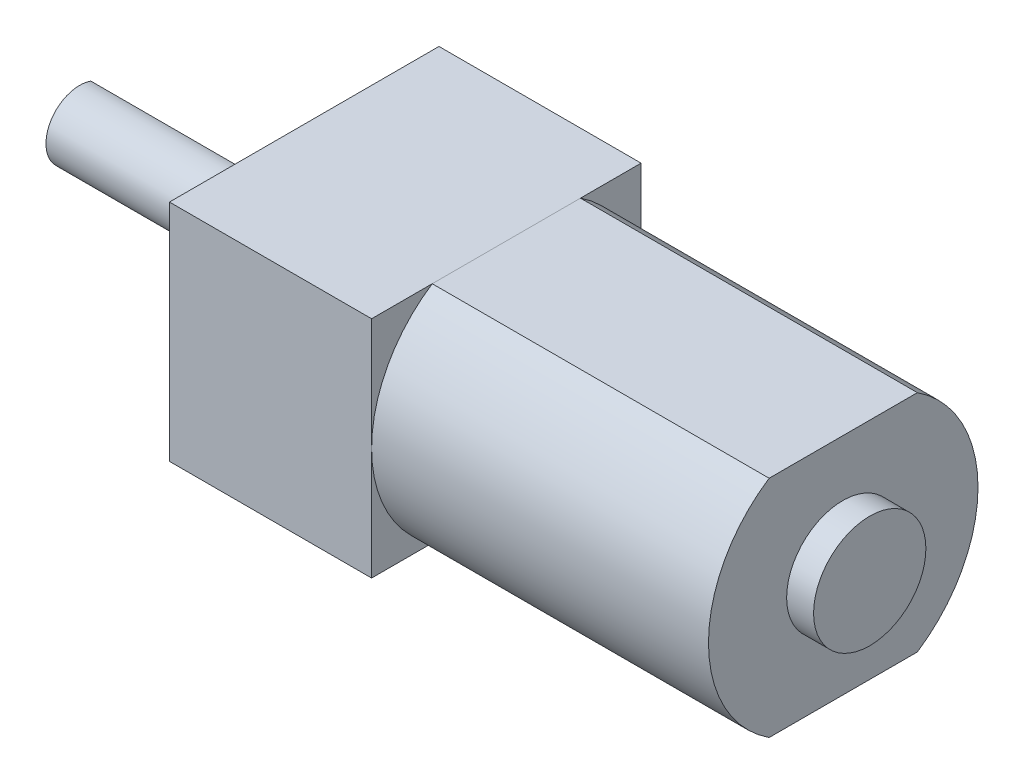
ISO-10303-21;
HEADER;
FILE_DESCRIPTION(('STEP AP214'),'2;1');
FILE_NAME('part.step','',(''),(''),'','','');
FILE_SCHEMA(('AUTOMOTIVE_DESIGN { 1 0 10303 214 1 1 1 1 }'));
ENDSEC;
DATA;
#1=APPLICATION_CONTEXT('core data for automotive mechanical design processes');
#2=APPLICATION_PROTOCOL_DEFINITION('international standard','automotive_design',2000,#1);
#3=PRODUCT_CONTEXT('',#1,'mechanical');
#4=PRODUCT('Part','Part','',(#3));
#5=PRODUCT_RELATED_PRODUCT_CATEGORY('part','',(#4));
#6=PRODUCT_DEFINITION_FORMATION('','',#4);
#7=PRODUCT_DEFINITION_CONTEXT('part definition',#1,'design');
#8=PRODUCT_DEFINITION('design','',#6,#7);
#9=PRODUCT_DEFINITION_SHAPE('','',#8);
#10=(LENGTH_UNIT() NAMED_UNIT(*) SI_UNIT(.MILLI.,.METRE.));
#11=(NAMED_UNIT(*) PLANE_ANGLE_UNIT() SI_UNIT($,.RADIAN.));
#12=(NAMED_UNIT(*) SI_UNIT($,.STERADIAN.) SOLID_ANGLE_UNIT());
#13=UNCERTAINTY_MEASURE_WITH_UNIT(LENGTH_MEASURE(1.E-05),#10,'distance_accuracy_value','');
#14=(GEOMETRIC_REPRESENTATION_CONTEXT(3) GLOBAL_UNCERTAINTY_ASSIGNED_CONTEXT((#13)) GLOBAL_UNIT_ASSIGNED_CONTEXT((#10,
#11,#12)) REPRESENTATION_CONTEXT('',''));
#15=CARTESIAN_POINT('',(0.,0.,0.));
#16=DIRECTION('',(0.,0.,1.));
#17=DIRECTION('',(1.,0.,0.));
#18=AXIS2_PLACEMENT_3D('',#15,#16,#17);
#19=CARTESIAN_POINT('',(-19.,-0.929487179487178,0.));
#20=DIRECTION('',(1.,0.,0.));
#21=DIRECTION('',(0.,0.,-1.));
#22=AXIS2_PLACEMENT_3D('',#19,#20,#21);
#23=CYLINDRICAL_SURFACE('',#22,1.5);
#24=CARTESIAN_POINT('',(-9.,-0.929487179487178,0.));
#25=DIRECTION('',(-1.,0.,0.));
#26=DIRECTION('',(0.,0.,1.));
#27=AXIS2_PLACEMENT_3D('',#24,#25,#26);
#28=CIRCLE('',#27,1.5);
#29=CARTESIAN_POINT('',(-9.,-2.34370074186027,-0.500000000000001));
#30=VERTEX_POINT('',#29);
#31=CARTESIAN_POINT('',(-9.,0.484726382885917,-0.500000000000001));
#32=VERTEX_POINT('',#31);
#33=EDGE_CURVE('E75',#30,#32,#28,.T.);
#34=ORIENTED_EDGE('',*,*,#33,.T.);
#35=DIRECTION('',(1.,0.,0.));
#36=VECTOR('',#35,1.);
#37=CARTESIAN_POINT('',(-19.,0.484726382885917,-0.500000000000001));
#38=LINE('',#37,#36);
#39=CARTESIAN_POINT('',(-19.,0.484726382885917,-0.500000000000001));
#40=VERTEX_POINT('',#39);
#41=EDGE_CURVE('E12',#40,#32,#38,.T.);
#42=ORIENTED_EDGE('',*,*,#41,.F.);
#43=CARTESIAN_POINT('',(-19.,-0.929487179487178,0.));
#44=DIRECTION('',(-1.,0.,0.));
#45=DIRECTION('',(0.,0.,1.));
#46=AXIS2_PLACEMENT_3D('',#43,#44,#45);
#47=CIRCLE('',#46,1.5);
#48=CARTESIAN_POINT('',(-19.,-2.34370074186027,-0.500000000000001));
#49=VERTEX_POINT('',#48);
#50=EDGE_CURVE('E74',#49,#40,#47,.T.);
#51=ORIENTED_EDGE('',*,*,#50,.F.);
#52=DIRECTION('',(1.,0.,0.));
#53=VECTOR('',#52,1.);
#54=CARTESIAN_POINT('',(-19.,-2.34370074186027,-0.500000000000001));
#55=LINE('',#54,#53);
#56=EDGE_CURVE('E52',#49,#30,#55,.T.);
#57=ORIENTED_EDGE('',*,*,#56,.T.);
#58=EDGE_LOOP('',(#34,#42,#51,#57));
#59=FACE_BOUND('',#58,.T.);
#60=ADVANCED_FACE('F44',(#59),#23,.T.);
#61=CARTESIAN_POINT('',(-19.,-2.34370074186027,-0.500000000000001));
#62=DIRECTION('',(0.,0.,1.));
#63=DIRECTION('',(1.,0.,0.));
#64=AXIS2_PLACEMENT_3D('',#61,#62,#63);
#65=PLANE('',#64);
#66=DIRECTION('',(0.,-1.,0.));
#67=VECTOR('',#66,1.);
#68=CARTESIAN_POINT('',(-9.,-2.34370074186027,-0.500000000000001));
#69=LINE('',#68,#67);
#70=EDGE_CURVE('E67',#32,#30,#69,.T.);
#71=ORIENTED_EDGE('',*,*,#70,.T.);
#72=ORIENTED_EDGE('',*,*,#56,.F.);
#73=DIRECTION('',(0.,-1.,0.));
#74=VECTOR('',#73,1.);
#75=CARTESIAN_POINT('',(-19.,-2.34370074186027,-0.500000000000001));
#76=LINE('',#75,#74);
#77=EDGE_CURVE('E59',#40,#49,#76,.T.);
#78=ORIENTED_EDGE('',*,*,#77,.F.);
#79=ORIENTED_EDGE('',*,*,#41,.T.);
#80=EDGE_LOOP('',(#71,#72,#78,#79));
#81=FACE_BOUND('',#80,.T.);
#82=ADVANCED_FACE('F70',(#81),#65,.F.);
#83=CARTESIAN_POINT('',(-19.,-0.929487179487178,0.));
#84=DIRECTION('',(-1.,0.,0.));
#85=DIRECTION('',(0.,0.,1.));
#86=AXIS2_PLACEMENT_3D('',#83,#84,#85);
#87=PLANE('',#86);
#88=ORIENTED_EDGE('',*,*,#50,.T.);
#89=ORIENTED_EDGE('',*,*,#77,.T.);
#90=EDGE_LOOP('',(#88,#89));
#91=FACE_BOUND('',#90,.T.);
#92=ADVANCED_FACE('F82',(#91),#87,.T.);
#93=CARTESIAN_POINT('',(-9.,-0.929487179487178,0.));
#94=DIRECTION('',(-1.,0.,0.));
#95=DIRECTION('',(0.,0.,1.));
#96=AXIS2_PLACEMENT_3D('',#93,#94,#95);
#97=PLANE('',#96);
#98=ORIENTED_EDGE('',*,*,#33,.F.);
#99=ORIENTED_EDGE('',*,*,#70,.F.);
#100=EDGE_LOOP('',(#98,#99));
#101=FACE_BOUND('',#100,.T.);
#102=ADVANCED_FACE('F78',(#101),#97,.F.);
#103=CLOSED_SHELL('',(#60,#82,#92,#102));
#104=MANIFOLD_SOLID_BREP('B2',#103);
#105=CARTESIAN_POINT('',(-9.,4.07051282051282,-6.));
#106=DIRECTION('',(0.,1.,0.));
#107=DIRECTION('',(0.,0.,1.));
#108=AXIS2_PLACEMENT_3D('',#105,#106,#107);
#109=PLANE('',#108);
#110=DIRECTION('',(0.,0.,1.));
#111=VECTOR('',#110,1.);
#112=CARTESIAN_POINT('',(0.,4.07051282051282,-6.));
#113=LINE('',#112,#111);
#114=CARTESIAN_POINT('',(0.,4.07051282051282,-6.));
#115=VERTEX_POINT('',#114);
#116=CARTESIAN_POINT('',(0.,4.07051282051282,6.));
#117=VERTEX_POINT('',#116);
#118=EDGE_CURVE('E189',#115,#117,#113,.T.);
#119=ORIENTED_EDGE('',*,*,#118,.F.);
#120=DIRECTION('',(1.,0.,0.));
#121=VECTOR('',#120,1.);
#122=CARTESIAN_POINT('',(-9.,4.07051282051282,-6.));
#123=LINE('',#122,#121);
#124=CARTESIAN_POINT('',(-9.,4.07051282051282,-6.));
#125=VERTEX_POINT('',#124);
#126=EDGE_CURVE('E42',#125,#115,#123,.T.);
#127=ORIENTED_EDGE('',*,*,#126,.F.);
#128=DIRECTION('',(0.,0.,1.));
#129=VECTOR('',#128,1.);
#130=CARTESIAN_POINT('',(-9.,4.07051282051282,-6.));
#131=LINE('',#130,#129);
#132=CARTESIAN_POINT('',(-9.,4.07051282051282,6.));
#133=VERTEX_POINT('',#132);
#134=EDGE_CURVE('E183',#125,#133,#131,.T.);
#135=ORIENTED_EDGE('',*,*,#134,.T.);
#136=DIRECTION('',(1.,0.,0.));
#137=VECTOR('',#136,1.);
#138=CARTESIAN_POINT('',(-9.,4.07051282051282,6.));
#139=LINE('',#138,#137);
#140=EDGE_CURVE('E128',#133,#117,#139,.T.);
#141=ORIENTED_EDGE('',*,*,#140,.T.);
#142=EDGE_LOOP('',(#119,#127,#135,#141));
#143=FACE_BOUND('',#142,.T.);
#144=ADVANCED_FACE('F125',(#143),#109,.T.);
#145=CARTESIAN_POINT('',(-9.,-5.92948717948718,-6.));
#146=DIRECTION('',(0.,0.,-1.));
#147=DIRECTION('',(0.,1.,0.));
#148=AXIS2_PLACEMENT_3D('',#145,#146,#147);
#149=PLANE('',#148);
#150=DIRECTION('',(0.,1.,0.));
#151=VECTOR('',#150,1.);
#152=CARTESIAN_POINT('',(0.,-5.92948717948718,-6.));
#153=LINE('',#152,#151);
#154=CARTESIAN_POINT('',(0.,-5.92948717948718,-6.));
#155=VERTEX_POINT('',#154);
#156=EDGE_CURVE('E185',#155,#115,#153,.T.);
#157=ORIENTED_EDGE('',*,*,#156,.F.);
#158=DIRECTION('',(1.,0.,0.));
#159=VECTOR('',#158,1.);
#160=CARTESIAN_POINT('',(-9.,-5.92948717948718,-6.));
#161=LINE('',#160,#159);
#162=CARTESIAN_POINT('',(-9.,-5.92948717948718,-6.));
#163=VERTEX_POINT('',#162);
#164=EDGE_CURVE('E134',#163,#155,#161,.T.);
#165=ORIENTED_EDGE('',*,*,#164,.F.);
#166=DIRECTION('',(0.,1.,0.));
#167=VECTOR('',#166,1.);
#168=CARTESIAN_POINT('',(-9.,-5.92948717948718,-6.));
#169=LINE('',#168,#167);
#170=EDGE_CURVE('E176',#163,#125,#169,.T.);
#171=ORIENTED_EDGE('',*,*,#170,.T.);
#172=ORIENTED_EDGE('',*,*,#126,.T.);
#173=EDGE_LOOP('',(#157,#165,#171,#172));
#174=FACE_BOUND('',#173,.T.);
#175=ADVANCED_FACE('F199',(#174),#149,.T.);
#176=CARTESIAN_POINT('',(-9.,-5.92948717948718,-6.));
#177=DIRECTION('',(0.,1.,0.));
#178=DIRECTION('',(0.,0.,1.));
#179=AXIS2_PLACEMENT_3D('',#176,#177,#178);
#180=PLANE('',#179);
#181=DIRECTION('',(0.,0.,1.));
#182=VECTOR('',#181,1.);
#183=CARTESIAN_POINT('',(0.,-5.92948717948718,-6.));
#184=LINE('',#183,#182);
#185=CARTESIAN_POINT('',(0.,-5.92948717948718,6.));
#186=VERTEX_POINT('',#185);
#187=EDGE_CURVE('E180',#155,#186,#184,.T.);
#188=ORIENTED_EDGE('',*,*,#187,.T.);
#189=DIRECTION('',(1.,0.,0.));
#190=VECTOR('',#189,1.);
#191=CARTESIAN_POINT('',(-9.,-5.92948717948718,6.));
#192=LINE('',#191,#190);
#193=CARTESIAN_POINT('',(-9.,-5.92948717948718,6.));
#194=VERTEX_POINT('',#193);
#195=EDGE_CURVE('E178',#194,#186,#192,.T.);
#196=ORIENTED_EDGE('',*,*,#195,.F.);
#197=DIRECTION('',(0.,0.,1.));
#198=VECTOR('',#197,1.);
#199=CARTESIAN_POINT('',(-9.,-5.92948717948718,-6.));
#200=LINE('',#199,#198);
#201=EDGE_CURVE('E172',#163,#194,#200,.T.);
#202=ORIENTED_EDGE('',*,*,#201,.F.);
#203=ORIENTED_EDGE('',*,*,#164,.T.);
#204=EDGE_LOOP('',(#188,#196,#202,#203));
#205=FACE_BOUND('',#204,.T.);
#206=ADVANCED_FACE('F179',(#205),#180,.F.);
#207=CARTESIAN_POINT('',(-9.,4.07051282051282,6.));
#208=DIRECTION('',(0.,0.,1.));
#209=DIRECTION('',(0.,-1.,0.));
#210=AXIS2_PLACEMENT_3D('',#207,#208,#209);
#211=PLANE('',#210);
#212=DIRECTION('',(0.,-1.,0.));
#213=VECTOR('',#212,1.);
#214=CARTESIAN_POINT('',(0.,4.07051282051282,6.));
#215=LINE('',#214,#213);
#216=EDGE_CURVE('E192',#117,#186,#215,.T.);
#217=ORIENTED_EDGE('',*,*,#216,.F.);
#218=ORIENTED_EDGE('',*,*,#140,.F.);
#219=DIRECTION('',(0.,-1.,0.));
#220=VECTOR('',#219,1.);
#221=CARTESIAN_POINT('',(-9.,4.07051282051282,6.));
#222=LINE('',#221,#220);
#223=EDGE_CURVE('E175',#133,#194,#222,.T.);
#224=ORIENTED_EDGE('',*,*,#223,.T.);
#225=ORIENTED_EDGE('',*,*,#195,.T.);
#226=EDGE_LOOP('',(#217,#218,#224,#225));
#227=FACE_BOUND('',#226,.T.);
#228=ADVANCED_FACE('F182',(#227),#211,.T.);
#229=CARTESIAN_POINT('',(-9.,0.,0.));
#230=DIRECTION('',(1.,0.,0.));
#231=DIRECTION('',(0.,0.,-1.));
#232=AXIS2_PLACEMENT_3D('',#229,#230,#231);
#233=PLANE('',#232);
#234=ORIENTED_EDGE('',*,*,#134,.F.);
#235=ORIENTED_EDGE('',*,*,#170,.F.);
#236=ORIENTED_EDGE('',*,*,#201,.T.);
#237=ORIENTED_EDGE('',*,*,#223,.F.);
#238=EDGE_LOOP('',(#234,#235,#236,#237));
#239=FACE_BOUND('',#238,.T.);
#240=ADVANCED_FACE('F174',(#239),#233,.F.);
#241=CARTESIAN_POINT('',(0.,0.,0.));
#242=DIRECTION('',(1.,0.,0.));
#243=DIRECTION('',(0.,0.,-1.));
#244=AXIS2_PLACEMENT_3D('',#241,#242,#243);
#245=PLANE('',#244);
#246=ORIENTED_EDGE('',*,*,#118,.T.);
#247=ORIENTED_EDGE('',*,*,#216,.T.);
#248=ORIENTED_EDGE('',*,*,#187,.F.);
#249=ORIENTED_EDGE('',*,*,#156,.T.);
#250=EDGE_LOOP('',(#246,#247,#248,#249));
#251=FACE_BOUND('',#250,.T.);
#252=ADVANCED_FACE('F198',(#251),#245,.T.);
#253=CLOSED_SHELL('',(#144,#175,#206,#228,#240,#252));
#254=MANIFOLD_SOLID_BREP('B6',#253);
#255=CARTESIAN_POINT('',(15.,-0.92948717948718,0.0203703703703694));
#256=DIRECTION('',(-1.,0.,0.));
#257=DIRECTION('',(0.,0.,1.));
#258=AXIS2_PLACEMENT_3D('',#255,#256,#257);
#259=CYLINDRICAL_SURFACE('',#258,5.97962962962963);
#260=CARTESIAN_POINT('',(0.,-0.92948717948718,0.0203703703703694));
#261=DIRECTION('',(-1.,0.,0.));
#262=DIRECTION('',(0.,0.,1.));
#263=AXIS2_PLACEMENT_3D('',#260,#261,#262);
#264=CIRCLE('',#263,5.97962962962963);
#265=CARTESIAN_POINT('',(0.,-5.92948717948718,3.3));
#266=VERTEX_POINT('',#265);
#267=CARTESIAN_POINT('',(0.,4.07051282051282,3.3));
#268=VERTEX_POINT('',#267);
#269=EDGE_CURVE('E317',#266,#268,#264,.T.);
#270=ORIENTED_EDGE('',*,*,#269,.F.);
#271=DIRECTION('',(-1.,0.,0.));
#272=VECTOR('',#271,1.);
#273=CARTESIAN_POINT('',(15.,-5.92948717948718,3.3));
#274=LINE('',#273,#272);
#275=CARTESIAN_POINT('',(15.,-5.92948717948718,3.3));
#276=VERTEX_POINT('',#275);
#277=EDGE_CURVE('E257',#276,#266,#274,.T.);
#278=ORIENTED_EDGE('',*,*,#277,.F.);
#279=CARTESIAN_POINT('',(15.,-0.92948717948718,0.0203703703703694));
#280=DIRECTION('',(-1.,0.,0.));
#281=DIRECTION('',(0.,0.,1.));
#282=AXIS2_PLACEMENT_3D('',#279,#280,#281);
#283=CIRCLE('',#282,5.97962962962963);
#284=CARTESIAN_POINT('',(15.,4.07051282051282,3.3));
#285=VERTEX_POINT('',#284);
#286=EDGE_CURVE('E311',#276,#285,#283,.T.);
#287=ORIENTED_EDGE('',*,*,#286,.T.);
#288=DIRECTION('',(-1.,0.,0.));
#289=VECTOR('',#288,1.);
#290=CARTESIAN_POINT('',(15.,4.07051282051282,3.3));
#291=LINE('',#290,#289);
#292=EDGE_CURVE('E308',#285,#268,#291,.T.);
#293=ORIENTED_EDGE('',*,*,#292,.T.);
#294=EDGE_LOOP('',(#270,#278,#287,#293));
#295=FACE_BOUND('',#294,.T.);
#296=ADVANCED_FACE('F249',(#295),#259,.T.);
#297=CARTESIAN_POINT('',(15.,-5.92948717948718,3.3));
#298=DIRECTION('',(0.,1.,0.));
#299=DIRECTION('',(0.,0.,1.));
#300=AXIS2_PLACEMENT_3D('',#297,#298,#299);
#301=PLANE('',#300);
#302=DIRECTION('',(0.,0.,-1.));
#303=VECTOR('',#302,1.);
#304=CARTESIAN_POINT('',(0.,-5.92948717948718,3.3));
#305=LINE('',#304,#303);
#306=CARTESIAN_POINT('',(0.,-5.92948717948718,-3.3));
#307=VERTEX_POINT('',#306);
#308=EDGE_CURVE('E281',#266,#307,#305,.T.);
#309=ORIENTED_EDGE('',*,*,#308,.T.);
#310=DIRECTION('',(-1.,0.,0.));
#311=VECTOR('',#310,1.);
#312=CARTESIAN_POINT('',(15.,-5.92948717948718,-3.3));
#313=LINE('',#312,#311);
#314=CARTESIAN_POINT('',(15.,-5.92948717948718,-3.3));
#315=VERTEX_POINT('',#314);
#316=EDGE_CURVE('E307',#315,#307,#313,.T.);
#317=ORIENTED_EDGE('',*,*,#316,.F.);
#318=DIRECTION('',(0.,0.,-1.));
#319=VECTOR('',#318,1.);
#320=CARTESIAN_POINT('',(15.,-5.92948717948718,3.3));
#321=LINE('',#320,#319);
#322=EDGE_CURVE('E296',#276,#315,#321,.T.);
#323=ORIENTED_EDGE('',*,*,#322,.F.);
#324=ORIENTED_EDGE('',*,*,#277,.T.);
#325=EDGE_LOOP('',(#309,#317,#323,#324));
#326=FACE_BOUND('',#325,.T.);
#327=ADVANCED_FACE('F342',(#326),#301,.F.);
#328=CARTESIAN_POINT('',(15.,-0.92948717948718,-0.0203703703703694));
#329=DIRECTION('',(-1.,0.,0.));
#330=DIRECTION('',(0.,0.,1.));
#331=AXIS2_PLACEMENT_3D('',#328,#329,#330);
#332=CYLINDRICAL_SURFACE('',#331,5.97962962962963);
#333=CARTESIAN_POINT('',(0.,-0.92948717948718,-0.0203703703703694));
#334=DIRECTION('',(1.,0.,0.));
#335=DIRECTION('',(0.,0.,-1.));
#336=AXIS2_PLACEMENT_3D('',#333,#334,#335);
#337=CIRCLE('',#336,5.97962962962963);
#338=CARTESIAN_POINT('',(0.,4.07051282051282,-3.3));
#339=VERTEX_POINT('',#338);
#340=EDGE_CURVE('E303',#307,#339,#337,.T.);
#341=ORIENTED_EDGE('',*,*,#340,.T.);
#342=DIRECTION('',(-1.,0.,0.));
#343=VECTOR('',#342,1.);
#344=CARTESIAN_POINT('',(15.,4.07051282051282,-3.3));
#345=LINE('',#344,#343);
#346=CARTESIAN_POINT('',(15.,4.07051282051282,-3.3));
#347=VERTEX_POINT('',#346);
#348=EDGE_CURVE('E300',#347,#339,#345,.T.);
#349=ORIENTED_EDGE('',*,*,#348,.F.);
#350=CARTESIAN_POINT('',(15.,-0.92948717948718,-0.0203703703703694));
#351=DIRECTION('',(1.,0.,0.));
#352=DIRECTION('',(0.,0.,-1.));
#353=AXIS2_PLACEMENT_3D('',#350,#351,#352);
#354=CIRCLE('',#353,5.97962962962963);
#355=EDGE_CURVE('E293',#315,#347,#354,.T.);
#356=ORIENTED_EDGE('',*,*,#355,.F.);
#357=ORIENTED_EDGE('',*,*,#316,.T.);
#358=EDGE_LOOP('',(#341,#349,#356,#357));
#359=FACE_BOUND('',#358,.T.);
#360=ADVANCED_FACE('F301',(#359),#332,.T.);
#361=CARTESIAN_POINT('',(15.,4.07051282051282,-3.3));
#362=DIRECTION('',(0.,-1.,0.));
#363=DIRECTION('',(0.,0.,-1.));
#364=AXIS2_PLACEMENT_3D('',#361,#362,#363);
#365=PLANE('',#364);
#366=DIRECTION('',(0.,0.,1.));
#367=VECTOR('',#366,1.);
#368=CARTESIAN_POINT('',(0.,4.07051282051282,-3.3));
#369=LINE('',#368,#367);
#370=EDGE_CURVE('E320',#339,#268,#369,.T.);
#371=ORIENTED_EDGE('',*,*,#370,.T.);
#372=ORIENTED_EDGE('',*,*,#292,.F.);
#373=DIRECTION('',(0.,0.,1.));
#374=VECTOR('',#373,1.);
#375=CARTESIAN_POINT('',(15.,4.07051282051282,-3.3));
#376=LINE('',#375,#374);
#377=EDGE_CURVE('E290',#347,#285,#376,.T.);
#378=ORIENTED_EDGE('',*,*,#377,.F.);
#379=ORIENTED_EDGE('',*,*,#348,.T.);
#380=EDGE_LOOP('',(#371,#372,#378,#379));
#381=FACE_BOUND('',#380,.T.);
#382=ADVANCED_FACE('F310',(#381),#365,.F.);
#383=CARTESIAN_POINT('',(15.,-0.92948717948718,0.0203703703703694));
#384=DIRECTION('',(-1.,0.,0.));
#385=DIRECTION('',(0.,0.,1.));
#386=AXIS2_PLACEMENT_3D('',#383,#384,#385);
#387=PLANE('',#386);
#388=CARTESIAN_POINT('',(15.,-0.92948717948718,0.0203703703703694));
#389=DIRECTION('',(-1.,0.,0.));
#390=DIRECTION('',(0.,0.,1.));
#391=AXIS2_PLACEMENT_3D('',#388,#389,#390);
#392=CIRCLE('',#391,2.5);
#393=CARTESIAN_POINT('',(15.,-0.92948717948718,2.52037037037037));
#394=VERTEX_POINT('',#393);
#395=EDGE_CURVE('E123',#394,#394,#392,.F.);
#396=ORIENTED_EDGE('',*,*,#395,.F.);
#397=EDGE_LOOP('',(#396));
#398=FACE_BOUND('',#397,.T.);
#399=ORIENTED_EDGE('',*,*,#286,.F.);
#400=ORIENTED_EDGE('',*,*,#322,.T.);
#401=ORIENTED_EDGE('',*,*,#355,.T.);
#402=ORIENTED_EDGE('',*,*,#377,.T.);
#403=EDGE_LOOP('',(#399,#400,#401,#402));
#404=FACE_BOUND('',#403,.T.);
#405=ADVANCED_FACE('F295',(#398,#404),#387,.F.);
#406=CARTESIAN_POINT('',(0.,-0.92948717948718,0.0203703703703694));
#407=DIRECTION('',(-1.,0.,0.));
#408=DIRECTION('',(0.,0.,1.));
#409=AXIS2_PLACEMENT_3D('',#406,#407,#408);
#410=PLANE('',#409);
#411=ORIENTED_EDGE('',*,*,#269,.T.);
#412=ORIENTED_EDGE('',*,*,#370,.F.);
#413=ORIENTED_EDGE('',*,*,#340,.F.);
#414=ORIENTED_EDGE('',*,*,#308,.F.);
#415=EDGE_LOOP('',(#411,#412,#413,#414));
#416=FACE_BOUND('',#415,.T.);
#417=ADVANCED_FACE('F327',(#416),#410,.T.);
#418=CARTESIAN_POINT('',(16.2,-0.92948717948718,0.0203703703703694));
#419=DIRECTION('',(-1.,0.,0.));
#420=DIRECTION('',(0.,0.,1.));
#421=AXIS2_PLACEMENT_3D('',#418,#419,#420);
#422=CYLINDRICAL_SURFACE('',#421,2.5);
#423=CARTESIAN_POINT('',(16.2,-0.92948717948718,0.0203703703703694));
#424=DIRECTION('',(1.,0.,0.));
#425=DIRECTION('',(0.,0.,-1.));
#426=AXIS2_PLACEMENT_3D('',#423,#424,#425);
#427=CIRCLE('',#426,2.5);
#428=CARTESIAN_POINT('',(16.2,-0.92948717948718,-2.47962962962963));
#429=VERTEX_POINT('',#428);
#430=EDGE_CURVE('E321',#429,#429,#427,.T.);
#431=ORIENTED_EDGE('',*,*,#430,.F.);
#432=EDGE_LOOP('',(#431));
#433=FACE_BOUND('',#432,.T.);
#434=ORIENTED_EDGE('',*,*,#395,.T.);
#435=EDGE_LOOP('',(#434));
#436=FACE_BOUND('',#435,.T.);
#437=ADVANCED_FACE('F329',(#433,#436),#422,.T.);
#438=CARTESIAN_POINT('',(16.2,-0.92948717948718,0.0203703703703694));
#439=DIRECTION('',(1.,0.,0.));
#440=DIRECTION('',(0.,0.,-1.));
#441=AXIS2_PLACEMENT_3D('',#438,#439,#440);
#442=PLANE('',#441);
#443=ORIENTED_EDGE('',*,*,#430,.T.);
#444=EDGE_LOOP('',(#443));
#445=FACE_BOUND('',#444,.T.);
#446=ADVANCED_FACE('F335',(#445),#442,.T.);
#447=CLOSED_SHELL('',(#296,#327,#360,#382,#405,#417,#437,#446));
#448=MANIFOLD_SOLID_BREP('B36',#447);
#449=ADVANCED_BREP_SHAPE_REPRESENTATION('',(#18,#104,#254,#448),#14);
#450=SHAPE_DEFINITION_REPRESENTATION(#9,#449);
ENDSEC;
END-ISO-10303-21;
